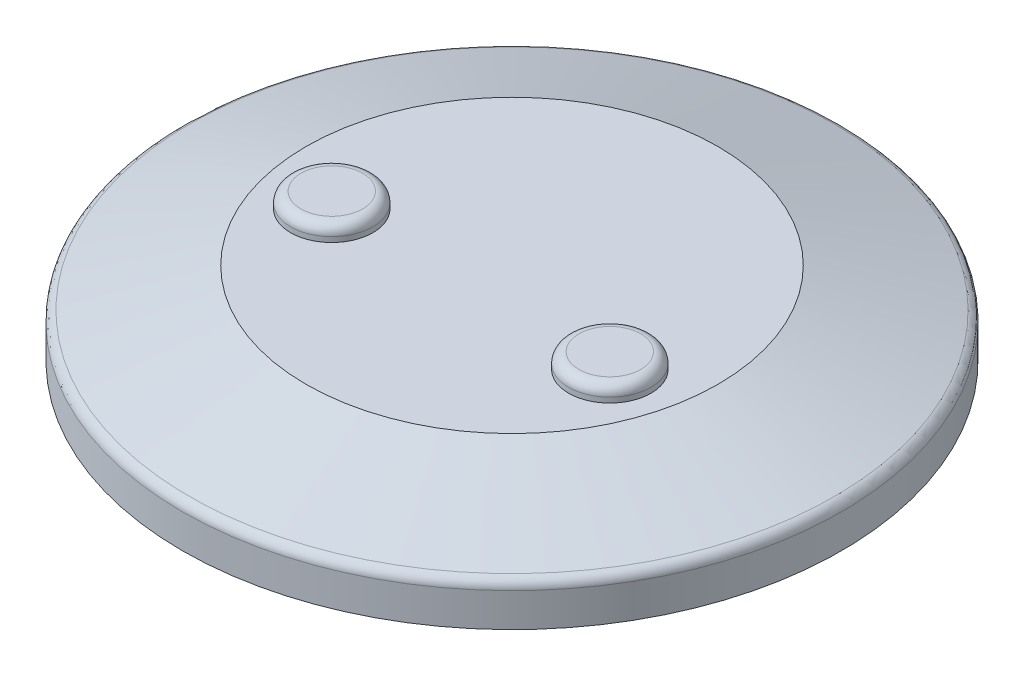
ISO-10303-21;
HEADER;
FILE_DESCRIPTION(('STEP AP214'),'2;1');
FILE_NAME('part.step','',(''),(''),'','','');
FILE_SCHEMA(('AUTOMOTIVE_DESIGN { 1 0 10303 214 1 1 1 1 }'));
ENDSEC;
DATA;
#1=APPLICATION_CONTEXT('core data for automotive mechanical design processes');
#2=APPLICATION_PROTOCOL_DEFINITION('international standard','automotive_design',2000,#1);
#3=PRODUCT_CONTEXT('',#1,'mechanical');
#4=PRODUCT('Part','Part','',(#3));
#5=PRODUCT_RELATED_PRODUCT_CATEGORY('part','',(#4));
#6=PRODUCT_DEFINITION_FORMATION('','',#4);
#7=PRODUCT_DEFINITION_CONTEXT('part definition',#1,'design');
#8=PRODUCT_DEFINITION('design','',#6,#7);
#9=PRODUCT_DEFINITION_SHAPE('','',#8);
#10=(LENGTH_UNIT() NAMED_UNIT(*) SI_UNIT(.MILLI.,.METRE.));
#11=(NAMED_UNIT(*) PLANE_ANGLE_UNIT() SI_UNIT($,.RADIAN.));
#12=(NAMED_UNIT(*) SI_UNIT($,.STERADIAN.) SOLID_ANGLE_UNIT());
#13=UNCERTAINTY_MEASURE_WITH_UNIT(LENGTH_MEASURE(1.E-05),#10,'distance_accuracy_value','');
#14=(GEOMETRIC_REPRESENTATION_CONTEXT(3) GLOBAL_UNCERTAINTY_ASSIGNED_CONTEXT((#13)) GLOBAL_UNIT_ASSIGNED_CONTEXT((#10,
#11,#12)) REPRESENTATION_CONTEXT('',''));
#15=CARTESIAN_POINT('',(0.,0.,0.));
#16=DIRECTION('',(0.,0.,1.));
#17=DIRECTION('',(1.,0.,0.));
#18=AXIS2_PLACEMENT_3D('',#15,#16,#17);
#19=CARTESIAN_POINT('',(0.,8.,0.));
#20=DIRECTION('',(0.,1.,0.));
#21=DIRECTION('',(0.,0.,1.));
#22=AXIS2_PLACEMENT_3D('',#19,#20,#21);
#23=PLANE('',#22);
#24=CARTESIAN_POINT('',(-13.5,8.,4.));
#25=DIRECTION('',(0.,1.,0.));
#26=DIRECTION('',(0.,0.,1.));
#27=AXIS2_PLACEMENT_3D('',#24,#25,#26);
#28=CIRCLE('',#27,4.);
#29=CARTESIAN_POINT('',(-13.5,8.,8.));
#30=VERTEX_POINT('',#29);
#31=EDGE_CURVE('E67',#30,#30,#28,.T.);
#32=ORIENTED_EDGE('',*,*,#31,.F.);
#33=EDGE_LOOP('',(#32));
#34=FACE_BOUND('',#33,.T.);
#35=CARTESIAN_POINT('',(0.,8.,0.));
#36=DIRECTION('',(0.,1.,0.));
#37=DIRECTION('',(0.,0.,1.));
#38=AXIS2_PLACEMENT_3D('',#35,#36,#37);
#39=CIRCLE('',#38,20.);
#40=CARTESIAN_POINT('',(0.,8.,20.));
#41=VERTEX_POINT('',#40);
#42=EDGE_CURVE('E62',#41,#41,#39,.T.);
#43=ORIENTED_EDGE('',*,*,#42,.T.);
#44=EDGE_LOOP('',(#43));
#45=FACE_BOUND('',#44,.T.);
#46=CARTESIAN_POINT('',(13.5,8.,4.));
#47=DIRECTION('',(0.,1.,0.));
#48=DIRECTION('',(0.,0.,1.));
#49=AXIS2_PLACEMENT_3D('',#46,#47,#48);
#50=CIRCLE('',#49,4.);
#51=CARTESIAN_POINT('',(13.5,8.,8.));
#52=VERTEX_POINT('',#51);
#53=EDGE_CURVE('E107',#52,#52,#50,.T.);
#54=ORIENTED_EDGE('',*,*,#53,.F.);
#55=EDGE_LOOP('',(#54));
#56=FACE_BOUND('',#55,.T.);
#57=ADVANCED_FACE('F33',(#34,#45,#56),#23,.T.);
#58=CARTESIAN_POINT('',(0.,4.,0.));
#59=DIRECTION('',(0.,-1.,0.));
#60=DIRECTION('',(0.,0.,-1.));
#61=AXIS2_PLACEMENT_3D('',#58,#59,#60);
#62=CYLINDRICAL_SURFACE('',#61,32.);
#63=CARTESIAN_POINT('',(0.,3.27924077994387,0.));
#64=DIRECTION('',(0.,-1.,0.));
#65=DIRECTION('',(0.,0.,-1.));
#66=AXIS2_PLACEMENT_3D('',#63,#64,#65);
#67=CIRCLE('',#66,32.);
#68=CARTESIAN_POINT('',(0.,3.27924077994387,-32.));
#69=VERTEX_POINT('',#68);
#70=EDGE_CURVE('E53',#69,#69,#67,.T.);
#71=ORIENTED_EDGE('',*,*,#70,.T.);
#72=EDGE_LOOP('',(#71));
#73=FACE_BOUND('',#72,.T.);
#74=CARTESIAN_POINT('',(0.,0.,0.));
#75=DIRECTION('',(0.,1.,0.));
#76=DIRECTION('',(0.,0.,1.));
#77=AXIS2_PLACEMENT_3D('',#74,#75,#76);
#78=CIRCLE('',#77,32.);
#79=CARTESIAN_POINT('',(0.,0.,32.));
#80=VERTEX_POINT('',#79);
#81=EDGE_CURVE('E59',#80,#80,#78,.T.);
#82=ORIENTED_EDGE('',*,*,#81,.T.);
#83=EDGE_LOOP('',(#82));
#84=FACE_BOUND('',#83,.T.);
#85=ADVANCED_FACE('F82',(#73,#84),#62,.T.);
#86=CARTESIAN_POINT('',(0.,0.,0.));
#87=DIRECTION('',(0.,1.,0.));
#88=DIRECTION('',(0.,0.,1.));
#89=AXIS2_PLACEMENT_3D('',#86,#87,#88);
#90=PLANE('',#89);
#91=ORIENTED_EDGE('',*,*,#81,.F.);
#92=EDGE_LOOP('',(#91));
#93=FACE_BOUND('',#92,.T.);
#94=ADVANCED_FACE('F91',(#93),#90,.F.);
#95=CARTESIAN_POINT('',(0.,8.,0.));
#96=DIRECTION('',(0.,-1.,0.));
#97=DIRECTION('',(0.,0.,-1.));
#98=AXIS2_PLACEMENT_3D('',#95,#96,#97);
#99=CONICAL_SURFACE('',#98,20.,1.24904577239825);
#100=CARTESIAN_POINT('',(0.,4.2279240779944,0.));
#101=DIRECTION('',(0.,-1.,0.));
#102=DIRECTION('',(0.,0.,-1.));
#103=AXIS2_PLACEMENT_3D('',#100,#101,#102);
#104=CIRCLE('',#103,31.3162277660168);
#105=CARTESIAN_POINT('',(0.,4.2279240779944,-31.3162277660168));
#106=VERTEX_POINT('',#105);
#107=EDGE_CURVE('E56',#106,#106,#104,.F.);
#108=ORIENTED_EDGE('',*,*,#107,.T.);
#109=EDGE_LOOP('',(#108));
#110=FACE_BOUND('',#109,.T.);
#111=ORIENTED_EDGE('',*,*,#42,.F.);
#112=EDGE_LOOP('',(#111));
#113=FACE_BOUND('',#112,.T.);
#114=ADVANCED_FACE('F86',(#110,#113),#99,.T.);
#115=CARTESIAN_POINT('',(0.,3.27924077994387,0.));
#116=DIRECTION('',(0.,-1.,0.));
#117=DIRECTION('',(0.,0.,-1.));
#118=AXIS2_PLACEMENT_3D('',#115,#116,#117);
#119=TOROIDAL_SURFACE('',#118,31.,1.);
#120=ORIENTED_EDGE('',*,*,#70,.F.);
#121=EDGE_LOOP('',(#120));
#122=FACE_BOUND('',#121,.T.);
#123=ORIENTED_EDGE('',*,*,#107,.F.);
#124=EDGE_LOOP('',(#123));
#125=FACE_BOUND('',#124,.T.);
#126=ADVANCED_FACE('F90',(#122,#125),#119,.T.);
#127=CARTESIAN_POINT('',(-13.5,9.5,4.));
#128=DIRECTION('',(0.,-1.,0.));
#129=DIRECTION('',(0.,0.,-1.));
#130=AXIS2_PLACEMENT_3D('',#127,#128,#129);
#131=CYLINDRICAL_SURFACE('',#130,4.);
#132=CARTESIAN_POINT('',(-13.5,8.5,4.));
#133=DIRECTION('',(0.,1.,0.));
#134=DIRECTION('',(0.,0.,1.));
#135=AXIS2_PLACEMENT_3D('',#132,#133,#134);
#136=CIRCLE('',#135,4.);
#137=CARTESIAN_POINT('',(-13.5,8.5,8.));
#138=VERTEX_POINT('',#137);
#139=EDGE_CURVE('E44',#138,#138,#136,.F.);
#140=ORIENTED_EDGE('',*,*,#139,.T.);
#141=EDGE_LOOP('',(#140));
#142=FACE_BOUND('',#141,.T.);
#143=ORIENTED_EDGE('',*,*,#31,.T.);
#144=EDGE_LOOP('',(#143));
#145=FACE_BOUND('',#144,.T.);
#146=ADVANCED_FACE('F84',(#142,#145),#131,.T.);
#147=CARTESIAN_POINT('',(-13.5,9.5,4.));
#148=DIRECTION('',(0.,1.,0.));
#149=DIRECTION('',(0.,0.,1.));
#150=AXIS2_PLACEMENT_3D('',#147,#148,#149);
#151=PLANE('',#150);
#152=CARTESIAN_POINT('',(-13.5,9.5,4.));
#153=DIRECTION('',(0.,1.,0.));
#154=DIRECTION('',(0.,0.,1.));
#155=AXIS2_PLACEMENT_3D('',#152,#153,#154);
#156=CIRCLE('',#155,3.);
#157=CARTESIAN_POINT('',(-13.5,9.5,7.));
#158=VERTEX_POINT('',#157);
#159=EDGE_CURVE('E48',#158,#158,#156,.T.);
#160=ORIENTED_EDGE('',*,*,#159,.T.);
#161=EDGE_LOOP('',(#160));
#162=FACE_BOUND('',#161,.T.);
#163=ADVANCED_FACE('F115',(#162),#151,.T.);
#164=CARTESIAN_POINT('',(13.5,9.5,4.));
#165=DIRECTION('',(0.,-1.,0.));
#166=DIRECTION('',(0.,0.,-1.));
#167=AXIS2_PLACEMENT_3D('',#164,#165,#166);
#168=CYLINDRICAL_SURFACE('',#167,4.);
#169=CARTESIAN_POINT('',(13.5,8.5,4.));
#170=DIRECTION('',(0.,1.,0.));
#171=DIRECTION('',(0.,0.,1.));
#172=AXIS2_PLACEMENT_3D('',#169,#170,#171);
#173=CIRCLE('',#172,4.);
#174=CARTESIAN_POINT('',(13.5,8.5,8.));
#175=VERTEX_POINT('',#174);
#176=EDGE_CURVE('E11',#175,#175,#173,.F.);
#177=ORIENTED_EDGE('',*,*,#176,.T.);
#178=EDGE_LOOP('',(#177));
#179=FACE_BOUND('',#178,.T.);
#180=ORIENTED_EDGE('',*,*,#53,.T.);
#181=EDGE_LOOP('',(#180));
#182=FACE_BOUND('',#181,.T.);
#183=ADVANCED_FACE('F111',(#179,#182),#168,.T.);
#184=CARTESIAN_POINT('',(13.5,9.5,4.));
#185=DIRECTION('',(0.,1.,0.));
#186=DIRECTION('',(0.,0.,1.));
#187=AXIS2_PLACEMENT_3D('',#184,#185,#186);
#188=PLANE('',#187);
#189=CARTESIAN_POINT('',(13.5,9.5,4.));
#190=DIRECTION('',(0.,1.,0.));
#191=DIRECTION('',(0.,0.,1.));
#192=AXIS2_PLACEMENT_3D('',#189,#190,#191);
#193=CIRCLE('',#192,3.);
#194=CARTESIAN_POINT('',(13.5,9.5,7.));
#195=VERTEX_POINT('',#194);
#196=EDGE_CURVE('E40',#195,#195,#193,.T.);
#197=ORIENTED_EDGE('',*,*,#196,.T.);
#198=EDGE_LOOP('',(#197));
#199=FACE_BOUND('',#198,.T.);
#200=ADVANCED_FACE('F114',(#199),#188,.T.);
#201=CARTESIAN_POINT('',(-13.5,8.5,4.));
#202=DIRECTION('',(0.,1.,0.));
#203=DIRECTION('',(0.,0.,1.));
#204=AXIS2_PLACEMENT_3D('',#201,#202,#203);
#205=TOROIDAL_SURFACE('',#204,3.,1.);
#206=ORIENTED_EDGE('',*,*,#139,.F.);
#207=EDGE_LOOP('',(#206));
#208=FACE_BOUND('',#207,.T.);
#209=ORIENTED_EDGE('',*,*,#159,.F.);
#210=EDGE_LOOP('',(#209));
#211=FACE_BOUND('',#210,.T.);
#212=ADVANCED_FACE('F121',(#208,#211),#205,.T.);
#213=CARTESIAN_POINT('',(13.5,8.5,4.));
#214=DIRECTION('',(0.,1.,0.));
#215=DIRECTION('',(0.,0.,1.));
#216=AXIS2_PLACEMENT_3D('',#213,#214,#215);
#217=TOROIDAL_SURFACE('',#216,3.,1.);
#218=ORIENTED_EDGE('',*,*,#176,.F.);
#219=EDGE_LOOP('',(#218));
#220=FACE_BOUND('',#219,.T.);
#221=ORIENTED_EDGE('',*,*,#196,.F.);
#222=EDGE_LOOP('',(#221));
#223=FACE_BOUND('',#222,.T.);
#224=ADVANCED_FACE('F35',(#220,#223),#217,.T.);
#225=CLOSED_SHELL('',(#57,#85,#94,#114,#126,#146,#163,#183,#200,#212,#224));
#226=MANIFOLD_SOLID_BREP('B2',#225);
#227=ADVANCED_BREP_SHAPE_REPRESENTATION('',(#18,#226),#14);
#228=SHAPE_DEFINITION_REPRESENTATION(#9,#227);
ENDSEC;
END-ISO-10303-21;
